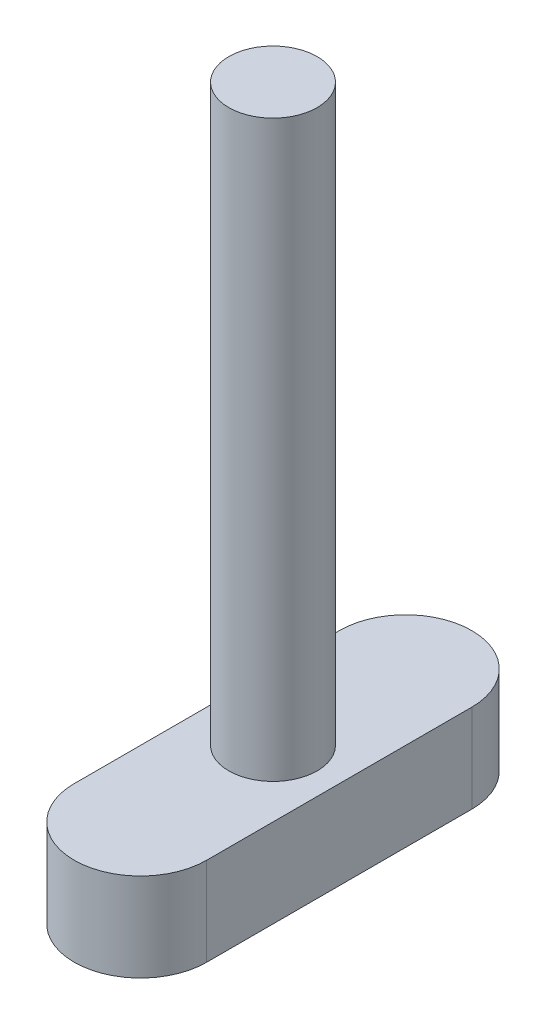
ISO-10303-21;
HEADER;
FILE_DESCRIPTION(('STEP AP214'),'2;1');
FILE_NAME('part.step','',(''),(''),'','','');
FILE_SCHEMA(('AUTOMOTIVE_DESIGN { 1 0 10303 214 1 1 1 1 }'));
ENDSEC;
DATA;
#1=APPLICATION_CONTEXT('core data for automotive mechanical design processes');
#2=APPLICATION_PROTOCOL_DEFINITION('international standard','automotive_design',2000,#1);
#3=PRODUCT_CONTEXT('',#1,'mechanical');
#4=PRODUCT('Part','Part','',(#3));
#5=PRODUCT_RELATED_PRODUCT_CATEGORY('part','',(#4));
#6=PRODUCT_DEFINITION_FORMATION('','',#4);
#7=PRODUCT_DEFINITION_CONTEXT('part definition',#1,'design');
#8=PRODUCT_DEFINITION('design','',#6,#7);
#9=PRODUCT_DEFINITION_SHAPE('','',#8);
#10=(LENGTH_UNIT() NAMED_UNIT(*) SI_UNIT(.MILLI.,.METRE.));
#11=(NAMED_UNIT(*) PLANE_ANGLE_UNIT() SI_UNIT($,.RADIAN.));
#12=(NAMED_UNIT(*) SI_UNIT($,.STERADIAN.) SOLID_ANGLE_UNIT());
#13=UNCERTAINTY_MEASURE_WITH_UNIT(LENGTH_MEASURE(1.E-05),#10,'distance_accuracy_value','');
#14=(GEOMETRIC_REPRESENTATION_CONTEXT(3) GLOBAL_UNCERTAINTY_ASSIGNED_CONTEXT((#13)) GLOBAL_UNIT_ASSIGNED_CONTEXT((#10,
#11,#12)) REPRESENTATION_CONTEXT('',''));
#15=CARTESIAN_POINT('',(0.,0.,0.));
#16=DIRECTION('',(0.,0.,1.));
#17=DIRECTION('',(1.,0.,0.));
#18=AXIS2_PLACEMENT_3D('',#15,#16,#17);
#19=CARTESIAN_POINT('',(0.,10.,-15.));
#20=DIRECTION('',(0.,-1.,0.));
#21=DIRECTION('',(0.,0.,-1.));
#22=AXIS2_PLACEMENT_3D('',#19,#20,#21);
#23=CYLINDRICAL_SURFACE('',#22,7.50000000000001);
#24=CARTESIAN_POINT('',(0.,0.,-15.));
#25=DIRECTION('',(0.,1.,0.));
#26=DIRECTION('',(0.,0.,1.));
#27=AXIS2_PLACEMENT_3D('',#24,#25,#26);
#28=CIRCLE('',#27,7.50000000000001);
#29=CARTESIAN_POINT('',(7.50000000000001,0.,-15.));
#30=VERTEX_POINT('',#29);
#31=CARTESIAN_POINT('',(-7.50000000000001,0.,-15.));
#32=VERTEX_POINT('',#31);
#33=EDGE_CURVE('E96',#30,#32,#28,.T.);
#34=ORIENTED_EDGE('',*,*,#33,.T.);
#35=DIRECTION('',(0.,-1.,0.));
#36=VECTOR('',#35,1.);
#37=CARTESIAN_POINT('',(-7.50000000000001,10.,-15.));
#38=LINE('',#37,#36);
#39=CARTESIAN_POINT('',(-7.50000000000001,10.,-15.));
#40=VERTEX_POINT('',#39);
#41=EDGE_CURVE('E11',#40,#32,#38,.T.);
#42=ORIENTED_EDGE('',*,*,#41,.F.);
#43=CARTESIAN_POINT('',(0.,10.,-15.));
#44=DIRECTION('',(0.,1.,0.));
#45=DIRECTION('',(0.,0.,1.));
#46=AXIS2_PLACEMENT_3D('',#43,#44,#45);
#47=CIRCLE('',#46,7.50000000000001);
#48=CARTESIAN_POINT('',(7.50000000000001,10.,-15.));
#49=VERTEX_POINT('',#48);
#50=EDGE_CURVE('E84',#49,#40,#47,.T.);
#51=ORIENTED_EDGE('',*,*,#50,.F.);
#52=DIRECTION('',(0.,-1.,0.));
#53=VECTOR('',#52,1.);
#54=CARTESIAN_POINT('',(7.50000000000001,10.,-15.));
#55=LINE('',#54,#53);
#56=EDGE_CURVE('E92',#49,#30,#55,.T.);
#57=ORIENTED_EDGE('',*,*,#56,.T.);
#58=EDGE_LOOP('',(#34,#42,#51,#57));
#59=FACE_BOUND('',#58,.T.);
#60=ADVANCED_FACE('F33',(#59),#23,.T.);
#61=CARTESIAN_POINT('',(-7.5,10.,15.));
#62=DIRECTION('',(1.,0.,0.));
#63=DIRECTION('',(0.,0.,-1.));
#64=AXIS2_PLACEMENT_3D('',#61,#62,#63);
#65=PLANE('',#64);
#66=DIRECTION('',(0.,0.,1.));
#67=VECTOR('',#66,1.);
#68=CARTESIAN_POINT('',(-7.5,0.,15.));
#69=LINE('',#68,#67);
#70=CARTESIAN_POINT('',(-7.5,0.,15.));
#71=VERTEX_POINT('',#70);
#72=EDGE_CURVE('E88',#32,#71,#69,.T.);
#73=ORIENTED_EDGE('',*,*,#72,.T.);
#74=DIRECTION('',(0.,-1.,0.));
#75=VECTOR('',#74,1.);
#76=CARTESIAN_POINT('',(-7.5,10.,15.));
#77=LINE('',#76,#75);
#78=CARTESIAN_POINT('',(-7.5,10.,15.));
#79=VERTEX_POINT('',#78);
#80=EDGE_CURVE('E41',#79,#71,#77,.T.);
#81=ORIENTED_EDGE('',*,*,#80,.F.);
#82=DIRECTION('',(0.,0.,1.));
#83=VECTOR('',#82,1.);
#84=CARTESIAN_POINT('',(-7.5,10.,15.));
#85=LINE('',#84,#83);
#86=EDGE_CURVE('E79',#40,#79,#85,.T.);
#87=ORIENTED_EDGE('',*,*,#86,.F.);
#88=ORIENTED_EDGE('',*,*,#41,.T.);
#89=EDGE_LOOP('',(#73,#81,#87,#88));
#90=FACE_BOUND('',#89,.T.);
#91=ADVANCED_FACE('F87',(#90),#65,.F.);
#92=CARTESIAN_POINT('',(0.,10.,15.));
#93=DIRECTION('',(0.,-1.,0.));
#94=DIRECTION('',(0.,0.,-1.));
#95=AXIS2_PLACEMENT_3D('',#92,#93,#94);
#96=CYLINDRICAL_SURFACE('',#95,7.5);
#97=CARTESIAN_POINT('',(0.,0.,15.));
#98=DIRECTION('',(0.,1.,0.));
#99=DIRECTION('',(0.,0.,-1.));
#100=AXIS2_PLACEMENT_3D('',#97,#98,#99);
#101=CIRCLE('',#100,7.5);
#102=CARTESIAN_POINT('',(7.5,0.,15.));
#103=VERTEX_POINT('',#102);
#104=EDGE_CURVE('E66',#71,#103,#101,.T.);
#105=ORIENTED_EDGE('',*,*,#104,.T.);
#106=DIRECTION('',(0.,-1.,0.));
#107=VECTOR('',#106,1.);
#108=CARTESIAN_POINT('',(7.5,10.,15.));
#109=LINE('',#108,#107);
#110=CARTESIAN_POINT('',(7.5,10.,15.));
#111=VERTEX_POINT('',#110);
#112=EDGE_CURVE('E89',#111,#103,#109,.T.);
#113=ORIENTED_EDGE('',*,*,#112,.F.);
#114=CARTESIAN_POINT('',(0.,10.,15.));
#115=DIRECTION('',(0.,1.,0.));
#116=DIRECTION('',(0.,0.,-1.));
#117=AXIS2_PLACEMENT_3D('',#114,#115,#116);
#118=CIRCLE('',#117,7.5);
#119=EDGE_CURVE('E82',#79,#111,#118,.T.);
#120=ORIENTED_EDGE('',*,*,#119,.F.);
#121=ORIENTED_EDGE('',*,*,#80,.T.);
#122=EDGE_LOOP('',(#105,#113,#120,#121));
#123=FACE_BOUND('',#122,.T.);
#124=ADVANCED_FACE('F90',(#123),#96,.T.);
#125=CARTESIAN_POINT('',(7.50000000000001,10.,-15.));
#126=DIRECTION('',(-1.,0.,0.));
#127=DIRECTION('',(0.,0.,1.));
#128=AXIS2_PLACEMENT_3D('',#125,#126,#127);
#129=PLANE('',#128);
#130=DIRECTION('',(0.,0.,-1.));
#131=VECTOR('',#130,1.);
#132=CARTESIAN_POINT('',(7.50000000000001,0.,-15.));
#133=LINE('',#132,#131);
#134=EDGE_CURVE('E72',#103,#30,#133,.T.);
#135=ORIENTED_EDGE('',*,*,#134,.T.);
#136=ORIENTED_EDGE('',*,*,#56,.F.);
#137=DIRECTION('',(0.,0.,-1.));
#138=VECTOR('',#137,1.);
#139=CARTESIAN_POINT('',(7.50000000000001,10.,-15.));
#140=LINE('',#139,#138);
#141=EDGE_CURVE('E49',#111,#49,#140,.T.);
#142=ORIENTED_EDGE('',*,*,#141,.F.);
#143=ORIENTED_EDGE('',*,*,#112,.T.);
#144=EDGE_LOOP('',(#135,#136,#142,#143));
#145=FACE_BOUND('',#144,.T.);
#146=ADVANCED_FACE('F104',(#145),#129,.F.);
#147=CARTESIAN_POINT('',(0.,10.,-15.));
#148=DIRECTION('',(0.,1.,0.));
#149=DIRECTION('',(0.,0.,1.));
#150=AXIS2_PLACEMENT_3D('',#147,#148,#149);
#151=PLANE('',#150);
#152=CARTESIAN_POINT('',(0.,10.,0.));
#153=DIRECTION('',(0.,1.,0.));
#154=DIRECTION('',(0.,0.,1.));
#155=AXIS2_PLACEMENT_3D('',#152,#153,#154);
#156=CIRCLE('',#155,5.);
#157=CARTESIAN_POINT('',(0.,10.,5.));
#158=VERTEX_POINT('',#157);
#159=EDGE_CURVE('E110',#158,#158,#156,.T.);
#160=ORIENTED_EDGE('',*,*,#159,.F.);
#161=EDGE_LOOP('',(#160));
#162=FACE_BOUND('',#161,.T.);
#163=ORIENTED_EDGE('',*,*,#50,.T.);
#164=ORIENTED_EDGE('',*,*,#86,.T.);
#165=ORIENTED_EDGE('',*,*,#119,.T.);
#166=ORIENTED_EDGE('',*,*,#141,.T.);
#167=EDGE_LOOP('',(#163,#164,#165,#166));
#168=FACE_BOUND('',#167,.T.);
#169=ADVANCED_FACE('F80',(#162,#168),#151,.T.);
#170=CARTESIAN_POINT('',(0.,0.,-15.));
#171=DIRECTION('',(0.,1.,0.));
#172=DIRECTION('',(0.,0.,1.));
#173=AXIS2_PLACEMENT_3D('',#170,#171,#172);
#174=PLANE('',#173);
#175=ORIENTED_EDGE('',*,*,#33,.F.);
#176=ORIENTED_EDGE('',*,*,#134,.F.);
#177=ORIENTED_EDGE('',*,*,#104,.F.);
#178=ORIENTED_EDGE('',*,*,#72,.F.);
#179=EDGE_LOOP('',(#175,#176,#177,#178));
#180=FACE_BOUND('',#179,.T.);
#181=ADVANCED_FACE('F107',(#180),#174,.F.);
#182=CARTESIAN_POINT('',(0.,75.,0.));
#183=DIRECTION('',(0.,-1.,0.));
#184=DIRECTION('',(0.,0.,-1.));
#185=AXIS2_PLACEMENT_3D('',#182,#183,#184);
#186=CYLINDRICAL_SURFACE('',#185,5.);
#187=CARTESIAN_POINT('',(0.,75.,0.));
#188=DIRECTION('',(0.,1.,0.));
#189=DIRECTION('',(0.,0.,1.));
#190=AXIS2_PLACEMENT_3D('',#187,#188,#189);
#191=CIRCLE('',#190,5.);
#192=CARTESIAN_POINT('',(0.,75.,5.));
#193=VERTEX_POINT('',#192);
#194=EDGE_CURVE('E99',#193,#193,#191,.T.);
#195=ORIENTED_EDGE('',*,*,#194,.F.);
#196=EDGE_LOOP('',(#195));
#197=FACE_BOUND('',#196,.T.);
#198=ORIENTED_EDGE('',*,*,#159,.T.);
#199=EDGE_LOOP('',(#198));
#200=FACE_BOUND('',#199,.T.);
#201=ADVANCED_FACE('F118',(#197,#200),#186,.T.);
#202=CARTESIAN_POINT('',(0.,75.,0.));
#203=DIRECTION('',(0.,1.,0.));
#204=DIRECTION('',(0.,0.,1.));
#205=AXIS2_PLACEMENT_3D('',#202,#203,#204);
#206=PLANE('',#205);
#207=ORIENTED_EDGE('',*,*,#194,.T.);
#208=EDGE_LOOP('',(#207));
#209=FACE_BOUND('',#208,.T.);
#210=ADVANCED_FACE('F116',(#209),#206,.T.);
#211=CLOSED_SHELL('',(#60,#91,#124,#146,#169,#181,#201,#210));
#212=MANIFOLD_SOLID_BREP('B2',#211);
#213=ADVANCED_BREP_SHAPE_REPRESENTATION('',(#18,#212),#14);
#214=SHAPE_DEFINITION_REPRESENTATION(#9,#213);
ENDSEC;
END-ISO-10303-21;
